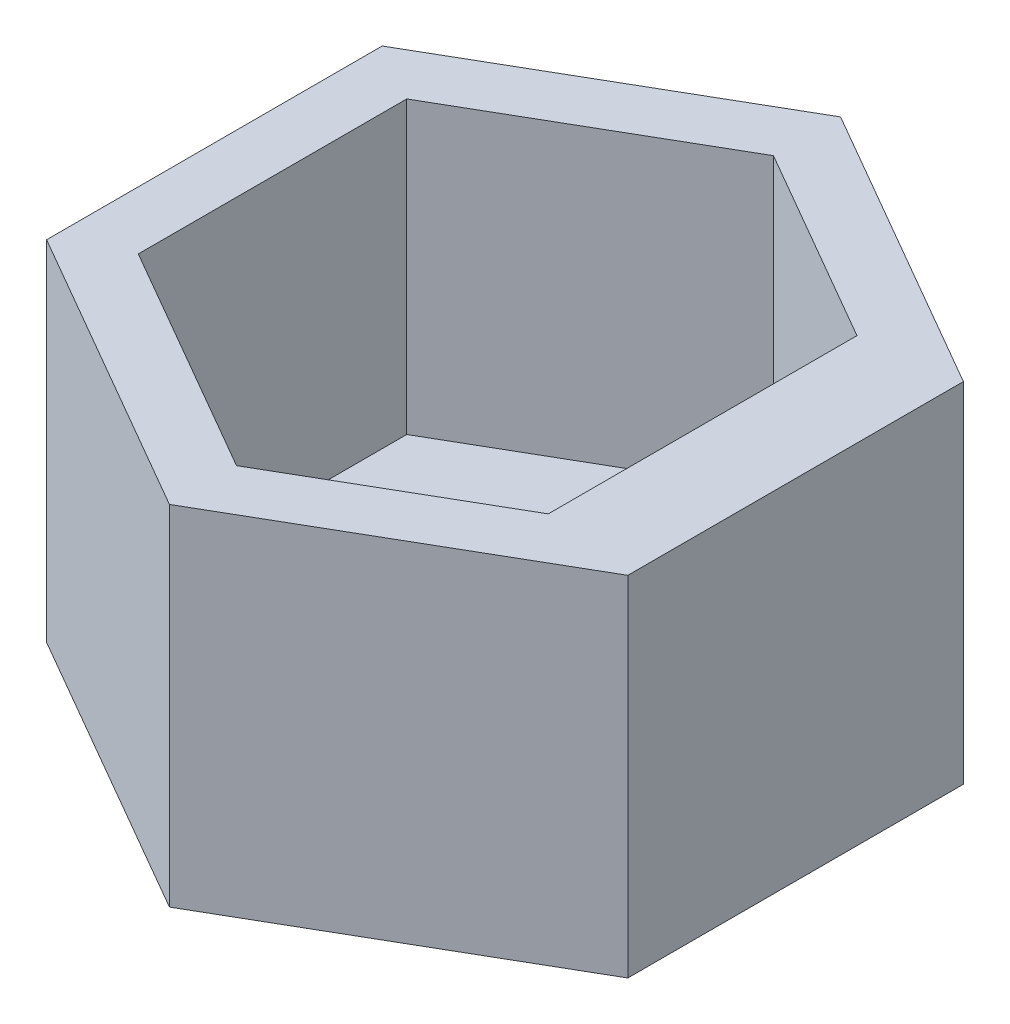
ISO-10303-21;
HEADER;
FILE_DESCRIPTION(('STEP AP214'),'2;1');
FILE_NAME('part.step','',(''),(''),'','','');
FILE_SCHEMA(('AUTOMOTIVE_DESIGN { 1 0 10303 214 1 1 1 1 }'));
ENDSEC;
DATA;
#1=APPLICATION_CONTEXT('core data for automotive mechanical design processes');
#2=APPLICATION_PROTOCOL_DEFINITION('international standard','automotive_design',2000,#1);
#3=PRODUCT_CONTEXT('',#1,'mechanical');
#4=PRODUCT('Part','Part','',(#3));
#5=PRODUCT_RELATED_PRODUCT_CATEGORY('part','',(#4));
#6=PRODUCT_DEFINITION_FORMATION('','',#4);
#7=PRODUCT_DEFINITION_CONTEXT('part definition',#1,'design');
#8=PRODUCT_DEFINITION('design','',#6,#7);
#9=PRODUCT_DEFINITION_SHAPE('','',#8);
#10=(LENGTH_UNIT() NAMED_UNIT(*) SI_UNIT(.MILLI.,.METRE.));
#11=(NAMED_UNIT(*) PLANE_ANGLE_UNIT() SI_UNIT($,.RADIAN.));
#12=(NAMED_UNIT(*) SI_UNIT($,.STERADIAN.) SOLID_ANGLE_UNIT());
#13=UNCERTAINTY_MEASURE_WITH_UNIT(LENGTH_MEASURE(1.E-05),#10,'distance_accuracy_value','');
#14=(GEOMETRIC_REPRESENTATION_CONTEXT(3) GLOBAL_UNCERTAINTY_ASSIGNED_CONTEXT((#13)) GLOBAL_UNIT_ASSIGNED_CONTEXT((#10,
#11,#12)) REPRESENTATION_CONTEXT('',''));
#15=CARTESIAN_POINT('',(0.,0.,0.));
#16=DIRECTION('',(0.,0.,1.));
#17=DIRECTION('',(1.,0.,0.));
#18=AXIS2_PLACEMENT_3D('',#15,#16,#17);
#19=CARTESIAN_POINT('',(25.,30.,-14.4337567297406));
#20=DIRECTION('',(-0.5,0.,0.866025403784439));
#21=DIRECTION('',(0.866025403784439,0.,0.5));
#22=AXIS2_PLACEMENT_3D('',#19,#20,#21);
#23=PLANE('',#22);
#24=DIRECTION('',(-0.866025403784439,0.,-0.5));
#25=VECTOR('',#24,1.);
#26=CARTESIAN_POINT('',(25.,0.,-14.4337567297406));
#27=LINE('',#26,#25);
#28=CARTESIAN_POINT('',(25.,0.,-14.4337567297406));
#29=VERTEX_POINT('',#28);
#30=CARTESIAN_POINT('',(0.,0.,-28.8675134594813));
#31=VERTEX_POINT('',#30);
#32=EDGE_CURVE('E125',#29,#31,#27,.T.);
#33=ORIENTED_EDGE('',*,*,#32,.T.);
#34=DIRECTION('',(0.,-1.,0.));
#35=VECTOR('',#34,1.);
#36=CARTESIAN_POINT('',(0.,30.,-28.8675134594813));
#37=LINE('',#36,#35);
#38=CARTESIAN_POINT('',(0.,30.,-28.8675134594813));
#39=VERTEX_POINT('',#38);
#40=EDGE_CURVE('E11',#39,#31,#37,.T.);
#41=ORIENTED_EDGE('',*,*,#40,.F.);
#42=DIRECTION('',(-0.866025403784439,0.,-0.5));
#43=VECTOR('',#42,1.);
#44=CARTESIAN_POINT('',(25.,30.,-14.4337567297406));
#45=LINE('',#44,#43);
#46=CARTESIAN_POINT('',(25.,30.,-14.4337567297406));
#47=VERTEX_POINT('',#46);
#48=EDGE_CURVE('E137',#47,#39,#45,.T.);
#49=ORIENTED_EDGE('',*,*,#48,.F.);
#50=DIRECTION('',(0.,-1.,0.));
#51=VECTOR('',#50,1.);
#52=CARTESIAN_POINT('',(25.,30.,-14.4337567297406));
#53=LINE('',#52,#51);
#54=EDGE_CURVE('E121',#47,#29,#53,.T.);
#55=ORIENTED_EDGE('',*,*,#54,.T.);
#56=EDGE_LOOP('',(#33,#41,#49,#55));
#57=FACE_BOUND('',#56,.T.);
#58=ADVANCED_FACE('F30',(#57),#23,.F.);
#59=CARTESIAN_POINT('',(0.,30.,-28.8675134594813));
#60=DIRECTION('',(0.5,0.,0.866025403784438));
#61=DIRECTION('',(0.866025403784439,0.,-0.5));
#62=AXIS2_PLACEMENT_3D('',#59,#60,#61);
#63=PLANE('',#62);
#64=DIRECTION('',(-0.866025403784438,0.,0.5));
#65=VECTOR('',#64,1.);
#66=CARTESIAN_POINT('',(0.,0.,-28.8675134594813));
#67=LINE('',#66,#65);
#68=CARTESIAN_POINT('',(-25.,0.,-14.4337567297406));
#69=VERTEX_POINT('',#68);
#70=EDGE_CURVE('E128',#31,#69,#67,.T.);
#71=ORIENTED_EDGE('',*,*,#70,.T.);
#72=DIRECTION('',(0.,-1.,0.));
#73=VECTOR('',#72,1.);
#74=CARTESIAN_POINT('',(-25.,30.,-14.4337567297406));
#75=LINE('',#74,#73);
#76=CARTESIAN_POINT('',(-25.,30.,-14.4337567297406));
#77=VERTEX_POINT('',#76);
#78=EDGE_CURVE('E37',#77,#69,#75,.T.);
#79=ORIENTED_EDGE('',*,*,#78,.F.);
#80=DIRECTION('',(-0.866025403784438,0.,0.5));
#81=VECTOR('',#80,1.);
#82=CARTESIAN_POINT('',(0.,30.,-28.8675134594813));
#83=LINE('',#82,#81);
#84=EDGE_CURVE('E88',#39,#77,#83,.T.);
#85=ORIENTED_EDGE('',*,*,#84,.F.);
#86=ORIENTED_EDGE('',*,*,#40,.T.);
#87=EDGE_LOOP('',(#71,#79,#85,#86));
#88=FACE_BOUND('',#87,.T.);
#89=ADVANCED_FACE('F260',(#88),#63,.F.);
#90=CARTESIAN_POINT('',(-25.,30.,-14.4337567297406));
#91=DIRECTION('',(1.,0.,0.));
#92=DIRECTION('',(0.,0.,-1.));
#93=AXIS2_PLACEMENT_3D('',#90,#91,#92);
#94=PLANE('',#93);
#95=DIRECTION('',(0.,0.,1.));
#96=VECTOR('',#95,1.);
#97=CARTESIAN_POINT('',(-25.,0.,-14.4337567297406));
#98=LINE('',#97,#96);
#99=CARTESIAN_POINT('',(-25.,0.,14.4337567297407));
#100=VERTEX_POINT('',#99);
#101=EDGE_CURVE('E131',#69,#100,#98,.T.);
#102=ORIENTED_EDGE('',*,*,#101,.T.);
#103=DIRECTION('',(0.,-1.,0.));
#104=VECTOR('',#103,1.);
#105=CARTESIAN_POINT('',(-25.,30.,14.4337567297407));
#106=LINE('',#105,#104);
#107=CARTESIAN_POINT('',(-25.,30.,14.4337567297407));
#108=VERTEX_POINT('',#107);
#109=EDGE_CURVE('E116',#108,#100,#106,.T.);
#110=ORIENTED_EDGE('',*,*,#109,.F.);
#111=DIRECTION('',(0.,0.,1.));
#112=VECTOR('',#111,1.);
#113=CARTESIAN_POINT('',(-25.,30.,-14.4337567297406));
#114=LINE('',#113,#112);
#115=EDGE_CURVE('E104',#77,#108,#114,.T.);
#116=ORIENTED_EDGE('',*,*,#115,.F.);
#117=ORIENTED_EDGE('',*,*,#78,.T.);
#118=EDGE_LOOP('',(#102,#110,#116,#117));
#119=FACE_BOUND('',#118,.T.);
#120=ADVANCED_FACE('F143',(#119),#94,.F.);
#121=CARTESIAN_POINT('',(-25.,30.,14.4337567297407));
#122=DIRECTION('',(0.5,0.,-0.866025403784439));
#123=DIRECTION('',(-0.866025403784439,0.,-0.5));
#124=AXIS2_PLACEMENT_3D('',#121,#122,#123);
#125=PLANE('',#124);
#126=DIRECTION('',(0.866025403784439,0.,0.5));
#127=VECTOR('',#126,1.);
#128=CARTESIAN_POINT('',(-25.,0.,14.4337567297407));
#129=LINE('',#128,#127);
#130=CARTESIAN_POINT('',(0.,0.,28.8675134594813));
#131=VERTEX_POINT('',#130);
#132=EDGE_CURVE('E113',#100,#131,#129,.T.);
#133=ORIENTED_EDGE('',*,*,#132,.T.);
#134=DIRECTION('',(0.,-1.,0.));
#135=VECTOR('',#134,1.);
#136=CARTESIAN_POINT('',(0.,30.,28.8675134594813));
#137=LINE('',#136,#135);
#138=CARTESIAN_POINT('',(0.,30.,28.8675134594813));
#139=VERTEX_POINT('',#138);
#140=EDGE_CURVE('E110',#139,#131,#137,.T.);
#141=ORIENTED_EDGE('',*,*,#140,.F.);
#142=DIRECTION('',(0.866025403784439,0.,0.5));
#143=VECTOR('',#142,1.);
#144=CARTESIAN_POINT('',(-25.,30.,14.4337567297407));
#145=LINE('',#144,#143);
#146=EDGE_CURVE('E97',#108,#139,#145,.T.);
#147=ORIENTED_EDGE('',*,*,#146,.F.);
#148=ORIENTED_EDGE('',*,*,#109,.T.);
#149=EDGE_LOOP('',(#133,#141,#147,#148));
#150=FACE_BOUND('',#149,.T.);
#151=ADVANCED_FACE('F111',(#150),#125,.F.);
#152=CARTESIAN_POINT('',(0.,30.,28.8675134594813));
#153=DIRECTION('',(-0.5,0.,-0.866025403784439));
#154=DIRECTION('',(-0.866025403784439,0.,0.5));
#155=AXIS2_PLACEMENT_3D('',#152,#153,#154);
#156=PLANE('',#155);
#157=DIRECTION('',(0.866025403784439,0.,-0.5));
#158=VECTOR('',#157,1.);
#159=CARTESIAN_POINT('',(0.,0.,28.8675134594813));
#160=LINE('',#159,#158);
#161=CARTESIAN_POINT('',(25.,0.,14.4337567297406));
#162=VERTEX_POINT('',#161);
#163=EDGE_CURVE('E134',#131,#162,#160,.T.);
#164=ORIENTED_EDGE('',*,*,#163,.T.);
#165=DIRECTION('',(0.,-1.,0.));
#166=VECTOR('',#165,1.);
#167=CARTESIAN_POINT('',(25.,30.,14.4337567297406));
#168=LINE('',#167,#166);
#169=CARTESIAN_POINT('',(25.,30.,14.4337567297406));
#170=VERTEX_POINT('',#169);
#171=EDGE_CURVE('E117',#170,#162,#168,.T.);
#172=ORIENTED_EDGE('',*,*,#171,.F.);
#173=DIRECTION('',(0.866025403784439,0.,-0.5));
#174=VECTOR('',#173,1.);
#175=CARTESIAN_POINT('',(0.,30.,28.8675134594813));
#176=LINE('',#175,#174);
#177=EDGE_CURVE('E101',#139,#170,#176,.T.);
#178=ORIENTED_EDGE('',*,*,#177,.F.);
#179=ORIENTED_EDGE('',*,*,#140,.T.);
#180=EDGE_LOOP('',(#164,#172,#178,#179));
#181=FACE_BOUND('',#180,.T.);
#182=ADVANCED_FACE('F119',(#181),#156,.F.);
#183=CARTESIAN_POINT('',(25.,30.,14.4337567297406));
#184=DIRECTION('',(-1.,0.,0.));
#185=DIRECTION('',(0.,0.,1.));
#186=AXIS2_PLACEMENT_3D('',#183,#184,#185);
#187=PLANE('',#186);
#188=DIRECTION('',(0.,0.,-1.));
#189=VECTOR('',#188,1.);
#190=CARTESIAN_POINT('',(25.,0.,14.4337567297406));
#191=LINE('',#190,#189);
#192=EDGE_CURVE('E80',#162,#29,#191,.T.);
#193=ORIENTED_EDGE('',*,*,#192,.T.);
#194=ORIENTED_EDGE('',*,*,#54,.F.);
#195=DIRECTION('',(0.,0.,-1.));
#196=VECTOR('',#195,1.);
#197=CARTESIAN_POINT('',(25.,30.,14.4337567297406));
#198=LINE('',#197,#196);
#199=EDGE_CURVE('E53',#170,#47,#198,.T.);
#200=ORIENTED_EDGE('',*,*,#199,.F.);
#201=ORIENTED_EDGE('',*,*,#171,.T.);
#202=EDGE_LOOP('',(#193,#194,#200,#201));
#203=FACE_BOUND('',#202,.T.);
#204=ADVANCED_FACE('F147',(#203),#187,.F.);
#205=CARTESIAN_POINT('',(0.,30.,-28.8675134594813));
#206=DIRECTION('',(0.,1.,0.));
#207=DIRECTION('',(0.,0.,1.));
#208=AXIS2_PLACEMENT_3D('',#205,#206,#207);
#209=PLANE('',#208);
#210=DIRECTION('',(-0.866025403784439,0.,-0.5));
#211=VECTOR('',#210,1.);
#212=CARTESIAN_POINT('',(22.5,30.,-10.1036297108185));
#213=LINE('',#212,#211);
#214=CARTESIAN_POINT('',(17.,30.,-13.2790561913614));
#215=VERTEX_POINT('',#214);
#216=CARTESIAN_POINT('',(0.,30.,-23.094010767585));
#217=VERTEX_POINT('',#216);
#218=EDGE_CURVE('E168',#215,#217,#213,.T.);
#219=ORIENTED_EDGE('',*,*,#218,.F.);
#220=DIRECTION('',(0.,0.,-1.));
#221=VECTOR('',#220,1.);
#222=CARTESIAN_POINT('',(17.,30.,14.4337567297406));
#223=LINE('',#222,#221);
#224=CARTESIAN_POINT('',(17.,30.,13.2790561913614));
#225=VERTEX_POINT('',#224);
#226=EDGE_CURVE('E154',#225,#215,#223,.T.);
#227=ORIENTED_EDGE('',*,*,#226,.F.);
#228=DIRECTION('',(0.866025403784439,0.,-0.5));
#229=VECTOR('',#228,1.);
#230=CARTESIAN_POINT('',(-2.5,30.,24.5373864405591));
#231=LINE('',#230,#229);
#232=CARTESIAN_POINT('',(0.,30.,23.094010767585));
#233=VERTEX_POINT('',#232);
#234=EDGE_CURVE('E157',#233,#225,#231,.T.);
#235=ORIENTED_EDGE('',*,*,#234,.F.);
#236=DIRECTION('',(0.866025403784439,0.,0.5));
#237=VECTOR('',#236,1.);
#238=CARTESIAN_POINT('',(-22.5,30.,10.1036297108185));
#239=LINE('',#238,#237);
#240=CARTESIAN_POINT('',(-20.,30.,11.5470053837925));
#241=VERTEX_POINT('',#240);
#242=EDGE_CURVE('E159',#241,#233,#239,.T.);
#243=ORIENTED_EDGE('',*,*,#242,.F.);
#244=DIRECTION('',(0.,0.,1.));
#245=VECTOR('',#244,1.);
#246=CARTESIAN_POINT('',(-20.,30.,-14.4337567297406));
#247=LINE('',#246,#245);
#248=CARTESIAN_POINT('',(-20.,30.,-11.5470053837925));
#249=VERTEX_POINT('',#248);
#250=EDGE_CURVE('E162',#249,#241,#247,.T.);
#251=ORIENTED_EDGE('',*,*,#250,.F.);
#252=DIRECTION('',(-0.866025403784439,0.,0.5));
#253=VECTOR('',#252,1.);
#254=CARTESIAN_POINT('',(2.49999999999999,30.,-24.5373864405591));
#255=LINE('',#254,#253);
#256=EDGE_CURVE('E165',#217,#249,#255,.T.);
#257=ORIENTED_EDGE('',*,*,#256,.F.);
#258=EDGE_LOOP('',(#219,#227,#235,#243,#251,#257));
#259=FACE_BOUND('',#258,.T.);
#260=ORIENTED_EDGE('',*,*,#48,.T.);
#261=ORIENTED_EDGE('',*,*,#84,.T.);
#262=ORIENTED_EDGE('',*,*,#115,.T.);
#263=ORIENTED_EDGE('',*,*,#146,.T.);
#264=ORIENTED_EDGE('',*,*,#177,.T.);
#265=ORIENTED_EDGE('',*,*,#199,.T.);
#266=EDGE_LOOP('',(#260,#261,#262,#263,#264,#265));
#267=FACE_BOUND('',#266,.T.);
#268=ADVANCED_FACE('F99',(#259,#267),#209,.T.);
#269=CARTESIAN_POINT('',(0.,0.,-28.8675134594813));
#270=DIRECTION('',(0.,1.,0.));
#271=DIRECTION('',(0.,0.,1.));
#272=AXIS2_PLACEMENT_3D('',#269,#270,#271);
#273=PLANE('',#272);
#274=ORIENTED_EDGE('',*,*,#32,.F.);
#275=ORIENTED_EDGE('',*,*,#192,.F.);
#276=ORIENTED_EDGE('',*,*,#163,.F.);
#277=ORIENTED_EDGE('',*,*,#132,.F.);
#278=ORIENTED_EDGE('',*,*,#101,.F.);
#279=ORIENTED_EDGE('',*,*,#70,.F.);
#280=EDGE_LOOP('',(#274,#275,#276,#277,#278,#279));
#281=FACE_BOUND('',#280,.T.);
#282=ADVANCED_FACE('F146',(#281),#273,.F.);
#283=CARTESIAN_POINT('',(22.5,30.,-10.1036297108185));
#284=DIRECTION('',(-0.5,0.,0.866025403784439));
#285=DIRECTION('',(0.866025403784439,0.,0.5));
#286=AXIS2_PLACEMENT_3D('',#283,#284,#285);
#287=PLANE('',#286);
#288=DIRECTION('',(-0.866025403784439,0.,-0.5));
#289=VECTOR('',#288,1.);
#290=CARTESIAN_POINT('',(22.5,5.,-10.1036297108185));
#291=LINE('',#290,#289);
#292=CARTESIAN_POINT('',(17.,5.,-13.2790561913614));
#293=VERTEX_POINT('',#292);
#294=CARTESIAN_POINT('',(0.,5.,-23.094010767585));
#295=VERTEX_POINT('',#294);
#296=EDGE_CURVE('E196',#293,#295,#291,.T.);
#297=ORIENTED_EDGE('',*,*,#296,.F.);
#298=DIRECTION('',(0.,-1.,0.));
#299=VECTOR('',#298,1.);
#300=CARTESIAN_POINT('',(17.,30.,-13.2790561913614));
#301=LINE('',#300,#299);
#302=EDGE_CURVE('E156',#215,#293,#301,.T.);
#303=ORIENTED_EDGE('',*,*,#302,.F.);
#304=ORIENTED_EDGE('',*,*,#218,.T.);
#305=DIRECTION('',(0.,-1.,0.));
#306=VECTOR('',#305,1.);
#307=CARTESIAN_POINT('',(0.,30.,-23.094010767585));
#308=LINE('',#307,#306);
#309=EDGE_CURVE('E129',#217,#295,#308,.T.);
#310=ORIENTED_EDGE('',*,*,#309,.T.);
#311=EDGE_LOOP('',(#297,#303,#304,#310));
#312=FACE_BOUND('',#311,.T.);
#313=ADVANCED_FACE('F212',(#312),#287,.T.);
#314=CARTESIAN_POINT('',(2.49999999999999,30.,-24.5373864405591));
#315=DIRECTION('',(0.5,0.,0.866025403784438));
#316=DIRECTION('',(0.866025403784439,0.,-0.5));
#317=AXIS2_PLACEMENT_3D('',#314,#315,#316);
#318=PLANE('',#317);
#319=DIRECTION('',(-0.866025403784439,0.,0.5));
#320=VECTOR('',#319,1.);
#321=CARTESIAN_POINT('',(2.49999999999999,5.,-24.5373864405591));
#322=LINE('',#321,#320);
#323=CARTESIAN_POINT('',(-20.,5.,-11.5470053837925));
#324=VERTEX_POINT('',#323);
#325=EDGE_CURVE('E191',#295,#324,#322,.T.);
#326=ORIENTED_EDGE('',*,*,#325,.F.);
#327=ORIENTED_EDGE('',*,*,#309,.F.);
#328=ORIENTED_EDGE('',*,*,#256,.T.);
#329=DIRECTION('',(0.,-1.,0.));
#330=VECTOR('',#329,1.);
#331=CARTESIAN_POINT('',(-20.,30.,-11.5470053837925));
#332=LINE('',#331,#330);
#333=EDGE_CURVE('E188',#249,#324,#332,.T.);
#334=ORIENTED_EDGE('',*,*,#333,.T.);
#335=EDGE_LOOP('',(#326,#327,#328,#334));
#336=FACE_BOUND('',#335,.T.);
#337=ADVANCED_FACE('F238',(#336),#318,.T.);
#338=CARTESIAN_POINT('',(-20.,30.,-14.4337567297406));
#339=DIRECTION('',(1.,0.,0.));
#340=DIRECTION('',(0.,0.,-1.));
#341=AXIS2_PLACEMENT_3D('',#338,#339,#340);
#342=PLANE('',#341);
#343=DIRECTION('',(0.,0.,1.));
#344=VECTOR('',#343,1.);
#345=CARTESIAN_POINT('',(-20.,5.,-14.4337567297406));
#346=LINE('',#345,#344);
#347=CARTESIAN_POINT('',(-20.,5.,11.5470053837925));
#348=VERTEX_POINT('',#347);
#349=EDGE_CURVE('E185',#324,#348,#346,.T.);
#350=ORIENTED_EDGE('',*,*,#349,.F.);
#351=ORIENTED_EDGE('',*,*,#333,.F.);
#352=ORIENTED_EDGE('',*,*,#250,.T.);
#353=DIRECTION('',(0.,-1.,0.));
#354=VECTOR('',#353,1.);
#355=CARTESIAN_POINT('',(-20.,30.,11.5470053837925));
#356=LINE('',#355,#354);
#357=EDGE_CURVE('E182',#241,#348,#356,.T.);
#358=ORIENTED_EDGE('',*,*,#357,.T.);
#359=EDGE_LOOP('',(#350,#351,#352,#358));
#360=FACE_BOUND('',#359,.T.);
#361=ADVANCED_FACE('F244',(#360),#342,.T.);
#362=CARTESIAN_POINT('',(-22.5,30.,10.1036297108185));
#363=DIRECTION('',(0.5,0.,-0.866025403784439));
#364=DIRECTION('',(-0.866025403784439,0.,-0.5));
#365=AXIS2_PLACEMENT_3D('',#362,#363,#364);
#366=PLANE('',#365);
#367=DIRECTION('',(0.866025403784439,0.,0.5));
#368=VECTOR('',#367,1.);
#369=CARTESIAN_POINT('',(-22.5,5.,10.1036297108185));
#370=LINE('',#369,#368);
#371=CARTESIAN_POINT('',(0.,5.,23.094010767585));
#372=VERTEX_POINT('',#371);
#373=EDGE_CURVE('E179',#348,#372,#370,.T.);
#374=ORIENTED_EDGE('',*,*,#373,.F.);
#375=ORIENTED_EDGE('',*,*,#357,.F.);
#376=ORIENTED_EDGE('',*,*,#242,.T.);
#377=DIRECTION('',(0.,-1.,0.));
#378=VECTOR('',#377,1.);
#379=CARTESIAN_POINT('',(0.,30.,23.094010767585));
#380=LINE('',#379,#378);
#381=EDGE_CURVE('E176',#233,#372,#380,.T.);
#382=ORIENTED_EDGE('',*,*,#381,.T.);
#383=EDGE_LOOP('',(#374,#375,#376,#382));
#384=FACE_BOUND('',#383,.T.);
#385=ADVANCED_FACE('F248',(#384),#366,.T.);
#386=CARTESIAN_POINT('',(-2.5,30.,24.5373864405591));
#387=DIRECTION('',(-0.5,0.,-0.866025403784439));
#388=DIRECTION('',(-0.866025403784439,0.,0.5));
#389=AXIS2_PLACEMENT_3D('',#386,#387,#388);
#390=PLANE('',#389);
#391=DIRECTION('',(0.866025403784439,0.,-0.5));
#392=VECTOR('',#391,1.);
#393=CARTESIAN_POINT('',(-2.5,5.,24.5373864405591));
#394=LINE('',#393,#392);
#395=CARTESIAN_POINT('',(17.,5.,13.2790561913614));
#396=VERTEX_POINT('',#395);
#397=EDGE_CURVE('E174',#372,#396,#394,.T.);
#398=ORIENTED_EDGE('',*,*,#397,.F.);
#399=ORIENTED_EDGE('',*,*,#381,.F.);
#400=ORIENTED_EDGE('',*,*,#234,.T.);
#401=DIRECTION('',(0.,-1.,0.));
#402=VECTOR('',#401,1.);
#403=CARTESIAN_POINT('',(17.,30.,13.2790561913614));
#404=LINE('',#403,#402);
#405=EDGE_CURVE('E44',#225,#396,#404,.T.);
#406=ORIENTED_EDGE('',*,*,#405,.T.);
#407=EDGE_LOOP('',(#398,#399,#400,#406));
#408=FACE_BOUND('',#407,.T.);
#409=ADVANCED_FACE('F250',(#408),#390,.T.);
#410=CARTESIAN_POINT('',(17.,30.,14.4337567297406));
#411=DIRECTION('',(-1.,0.,0.));
#412=DIRECTION('',(0.,0.,1.));
#413=AXIS2_PLACEMENT_3D('',#410,#411,#412);
#414=PLANE('',#413);
#415=DIRECTION('',(0.,0.,-1.));
#416=VECTOR('',#415,1.);
#417=CARTESIAN_POINT('',(17.,5.,14.4337567297406));
#418=LINE('',#417,#416);
#419=EDGE_CURVE('E171',#396,#293,#418,.T.);
#420=ORIENTED_EDGE('',*,*,#419,.F.);
#421=ORIENTED_EDGE('',*,*,#405,.F.);
#422=ORIENTED_EDGE('',*,*,#226,.T.);
#423=ORIENTED_EDGE('',*,*,#302,.T.);
#424=EDGE_LOOP('',(#420,#421,#422,#423));
#425=FACE_BOUND('',#424,.T.);
#426=ADVANCED_FACE('F232',(#425),#414,.T.);
#427=CARTESIAN_POINT('',(0.,5.,-28.8675134594813));
#428=DIRECTION('',(0.,1.,0.));
#429=DIRECTION('',(0.,0.,1.));
#430=AXIS2_PLACEMENT_3D('',#427,#428,#429);
#431=PLANE('',#430);
#432=ORIENTED_EDGE('',*,*,#296,.T.);
#433=ORIENTED_EDGE('',*,*,#325,.T.);
#434=ORIENTED_EDGE('',*,*,#349,.T.);
#435=ORIENTED_EDGE('',*,*,#373,.T.);
#436=ORIENTED_EDGE('',*,*,#397,.T.);
#437=ORIENTED_EDGE('',*,*,#419,.T.);
#438=EDGE_LOOP('',(#432,#433,#434,#435,#436,#437));
#439=FACE_BOUND('',#438,.T.);
#440=ADVANCED_FACE('F205',(#439),#431,.T.);
#441=CLOSED_SHELL('',(#58,#89,#120,#151,#182,#204,#268,#282,#313,#337,#361,#385,#409,#426,#440));
#442=MANIFOLD_SOLID_BREP('B2',#441);
#443=ADVANCED_BREP_SHAPE_REPRESENTATION('',(#18,#442),#14);
#444=SHAPE_DEFINITION_REPRESENTATION(#9,#443);
ENDSEC;
END-ISO-10303-21;
